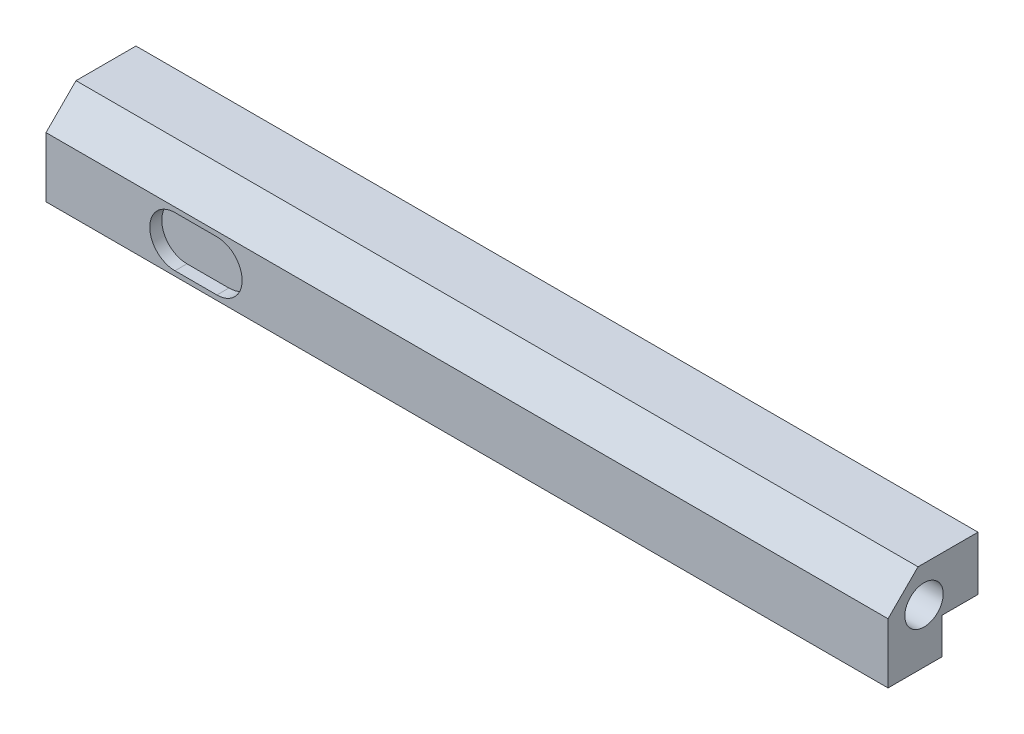
ISO-10303-21;
HEADER;
FILE_DESCRIPTION(('STEP AP214'),'2;1');
FILE_NAME('part.step','',(''),(''),'','','');
FILE_SCHEMA(('AUTOMOTIVE_DESIGN { 1 0 10303 214 1 1 1 1 }'));
ENDSEC;
DATA;
#1=APPLICATION_CONTEXT('core data for automotive mechanical design processes');
#2=APPLICATION_PROTOCOL_DEFINITION('international standard','automotive_design',2000,#1);
#3=PRODUCT_CONTEXT('',#1,'mechanical');
#4=PRODUCT('Part','Part','',(#3));
#5=PRODUCT_RELATED_PRODUCT_CATEGORY('part','',(#4));
#6=PRODUCT_DEFINITION_FORMATION('','',#4);
#7=PRODUCT_DEFINITION_CONTEXT('part definition',#1,'design');
#8=PRODUCT_DEFINITION('design','',#6,#7);
#9=PRODUCT_DEFINITION_SHAPE('','',#8);
#10=(LENGTH_UNIT() NAMED_UNIT(*) SI_UNIT(.MILLI.,.METRE.));
#11=(NAMED_UNIT(*) PLANE_ANGLE_UNIT() SI_UNIT($,.RADIAN.));
#12=(NAMED_UNIT(*) SI_UNIT($,.STERADIAN.) SOLID_ANGLE_UNIT());
#13=UNCERTAINTY_MEASURE_WITH_UNIT(LENGTH_MEASURE(1.E-05),#10,'distance_accuracy_value','');
#14=(GEOMETRIC_REPRESENTATION_CONTEXT(3) GLOBAL_UNCERTAINTY_ASSIGNED_CONTEXT((#13)) GLOBAL_UNIT_ASSIGNED_CONTEXT((#10,
#11,#12)) REPRESENTATION_CONTEXT('',''));
#15=CARTESIAN_POINT('',(0.,0.,0.));
#16=DIRECTION('',(0.,0.,1.));
#17=DIRECTION('',(1.,0.,0.));
#18=AXIS2_PLACEMENT_3D('',#15,#16,#17);
#19=CARTESIAN_POINT('',(70.2,-1.5,-1.5));
#20=DIRECTION('',(-1.,0.,0.));
#21=DIRECTION('',(0.,0.,1.));
#22=AXIS2_PLACEMENT_3D('',#19,#20,#21);
#23=CYLINDRICAL_SURFACE('',#22,2.35);
#24=CARTESIAN_POINT('',(-63.2,-1.5,-1.5));
#25=DIRECTION('',(-1.,0.,0.));
#26=DIRECTION('',(0.,0.,1.));
#27=AXIS2_PLACEMENT_3D('',#24,#25,#26);
#28=CIRCLE('',#27,2.35);
#29=CARTESIAN_POINT('',(-63.2,-1.5,0.85));
#30=VERTEX_POINT('',#29);
#31=EDGE_CURVE('E188',#30,#30,#28,.T.);
#32=ORIENTED_EDGE('',*,*,#31,.T.);
#33=EDGE_LOOP('',(#32));
#34=FACE_BOUND('',#33,.T.);
#35=CARTESIAN_POINT('',(63.2,-1.5,-1.5));
#36=DIRECTION('',(1.,0.,0.));
#37=DIRECTION('',(0.,0.,-1.));
#38=AXIS2_PLACEMENT_3D('',#35,#36,#37);
#39=CIRCLE('',#38,2.35);
#40=CARTESIAN_POINT('',(63.2,-1.5,-3.85));
#41=VERTEX_POINT('',#40);
#42=EDGE_CURVE('E174',#41,#41,#39,.T.);
#43=ORIENTED_EDGE('',*,*,#42,.T.);
#44=EDGE_LOOP('',(#43));
#45=FACE_BOUND('',#44,.T.);
#46=ADVANCED_FACE('F44',(#34,#45),#23,.F.);
#47=CARTESIAN_POINT('',(70.2,0.,0.));
#48=DIRECTION('',(-1.,0.,0.));
#49=DIRECTION('',(0.,0.,1.));
#50=AXIS2_PLACEMENT_3D('',#47,#48,#49);
#51=PLANE('',#50);
#52=CARTESIAN_POINT('',(70.2,-1.5,-1.5));
#53=DIRECTION('',(1.,0.,0.));
#54=DIRECTION('',(0.,0.,-1.));
#55=AXIS2_PLACEMENT_3D('',#52,#53,#54);
#56=CIRCLE('',#55,3.2);
#57=CARTESIAN_POINT('',(70.2,-1.5,-4.7));
#58=VERTEX_POINT('',#57);
#59=EDGE_CURVE('E183',#58,#58,#56,.T.);
#60=ORIENTED_EDGE('',*,*,#59,.F.);
#61=EDGE_LOOP('',(#60));
#62=FACE_BOUND('',#61,.T.);
#63=DIRECTION('',(0.,0.,1.));
#64=VECTOR('',#63,1.);
#65=CARTESIAN_POINT('',(70.2,4.5,4.5));
#66=LINE('',#65,#64);
#67=CARTESIAN_POINT('',(70.2,4.5,-10.5));
#68=VERTEX_POINT('',#67);
#69=CARTESIAN_POINT('',(70.2,4.5,-0.500000000000032));
#70=VERTEX_POINT('',#69);
#71=EDGE_CURVE('E218',#68,#70,#66,.T.);
#72=ORIENTED_EDGE('',*,*,#71,.T.);
#73=DIRECTION('',(0.,0.707106781186546,-0.707106781186549));
#74=VECTOR('',#73,1.);
#75=CARTESIAN_POINT('',(70.2,-0.500000000000004,4.5));
#76=LINE('',#75,#74);
#77=CARTESIAN_POINT('',(70.2,-0.500000000000004,4.5));
#78=VERTEX_POINT('',#77);
#79=EDGE_CURVE('E11',#70,#78,#76,.F.);
#80=ORIENTED_EDGE('',*,*,#79,.T.);
#81=DIRECTION('',(0.,-1.,0.));
#82=VECTOR('',#81,1.);
#83=CARTESIAN_POINT('',(70.2,-10.5,4.5));
#84=LINE('',#83,#82);
#85=CARTESIAN_POINT('',(70.2,-10.5,4.5));
#86=VERTEX_POINT('',#85);
#87=EDGE_CURVE('E221',#78,#86,#84,.T.);
#88=ORIENTED_EDGE('',*,*,#87,.T.);
#89=DIRECTION('',(0.,0.,-1.));
#90=VECTOR('',#89,1.);
#91=CARTESIAN_POINT('',(70.2,-10.5,-4.5));
#92=LINE('',#91,#90);
#93=CARTESIAN_POINT('',(70.2,-10.5,-4.5));
#94=VERTEX_POINT('',#93);
#95=EDGE_CURVE('E204',#86,#94,#92,.T.);
#96=ORIENTED_EDGE('',*,*,#95,.T.);
#97=DIRECTION('',(0.,1.,0.));
#98=VECTOR('',#97,1.);
#99=CARTESIAN_POINT('',(70.2,-4.5,-4.5));
#100=LINE('',#99,#98);
#101=CARTESIAN_POINT('',(70.2,-4.5,-4.5));
#102=VERTEX_POINT('',#101);
#103=EDGE_CURVE('E208',#94,#102,#100,.T.);
#104=ORIENTED_EDGE('',*,*,#103,.T.);
#105=DIRECTION('',(0.,0.,-1.));
#106=VECTOR('',#105,1.);
#107=CARTESIAN_POINT('',(70.2,-4.5,-10.5));
#108=LINE('',#107,#106);
#109=CARTESIAN_POINT('',(70.2,-4.5,-10.5));
#110=VERTEX_POINT('',#109);
#111=EDGE_CURVE('E212',#102,#110,#108,.T.);
#112=ORIENTED_EDGE('',*,*,#111,.T.);
#113=DIRECTION('',(0.,1.,0.));
#114=VECTOR('',#113,1.);
#115=CARTESIAN_POINT('',(70.2,4.5,-10.5));
#116=LINE('',#115,#114);
#117=EDGE_CURVE('E215',#110,#68,#116,.T.);
#118=ORIENTED_EDGE('',*,*,#117,.T.);
#119=EDGE_LOOP('',(#72,#80,#88,#96,#104,#112,#118));
#120=FACE_BOUND('',#119,.T.);
#121=ADVANCED_FACE('F281',(#62,#120),#51,.F.);
#122=CARTESIAN_POINT('',(-70.2,0.,0.));
#123=DIRECTION('',(-1.,0.,0.));
#124=DIRECTION('',(0.,0.,1.));
#125=AXIS2_PLACEMENT_3D('',#122,#123,#124);
#126=PLANE('',#125);
#127=CARTESIAN_POINT('',(-70.2,-1.5,-1.5));
#128=DIRECTION('',(-1.,0.,0.));
#129=DIRECTION('',(0.,0.,1.));
#130=AXIS2_PLACEMENT_3D('',#127,#128,#129);
#131=CIRCLE('',#130,3.2);
#132=CARTESIAN_POINT('',(-70.2,-1.5,1.7));
#133=VERTEX_POINT('',#132);
#134=EDGE_CURVE('E195',#133,#133,#131,.T.);
#135=ORIENTED_EDGE('',*,*,#134,.F.);
#136=EDGE_LOOP('',(#135));
#137=FACE_BOUND('',#136,.T.);
#138=DIRECTION('',(0.,-1.,0.));
#139=VECTOR('',#138,1.);
#140=CARTESIAN_POINT('',(-70.2,-10.5,4.5));
#141=LINE('',#140,#139);
#142=CARTESIAN_POINT('',(-70.2,-0.500000000000004,4.5));
#143=VERTEX_POINT('',#142);
#144=CARTESIAN_POINT('',(-70.2,-10.5,4.5));
#145=VERTEX_POINT('',#144);
#146=EDGE_CURVE('E209',#143,#145,#141,.T.);
#147=ORIENTED_EDGE('',*,*,#146,.F.);
#148=DIRECTION('',(0.,-0.707106781186546,0.707106781186549));
#149=VECTOR('',#148,1.);
#150=CARTESIAN_POINT('',(-70.2,2.,1.99999999999999));
#151=LINE('',#150,#149);
#152=CARTESIAN_POINT('',(-70.2,4.5,-0.500000000000032));
#153=VERTEX_POINT('',#152);
#154=EDGE_CURVE('E265',#143,#153,#151,.F.);
#155=ORIENTED_EDGE('',*,*,#154,.T.);
#156=DIRECTION('',(0.,0.,1.));
#157=VECTOR('',#156,1.);
#158=CARTESIAN_POINT('',(-70.2,4.5,4.5));
#159=LINE('',#158,#157);
#160=CARTESIAN_POINT('',(-70.2,4.5,-10.5));
#161=VERTEX_POINT('',#160);
#162=EDGE_CURVE('E237',#161,#153,#159,.T.);
#163=ORIENTED_EDGE('',*,*,#162,.F.);
#164=DIRECTION('',(0.,1.,0.));
#165=VECTOR('',#164,1.);
#166=CARTESIAN_POINT('',(-70.2,4.5,-10.5));
#167=LINE('',#166,#165);
#168=CARTESIAN_POINT('',(-70.2,-4.5,-10.5));
#169=VERTEX_POINT('',#168);
#170=EDGE_CURVE('E234',#169,#161,#167,.T.);
#171=ORIENTED_EDGE('',*,*,#170,.F.);
#172=DIRECTION('',(0.,0.,-1.));
#173=VECTOR('',#172,1.);
#174=CARTESIAN_POINT('',(-70.2,-4.5,-10.5));
#175=LINE('',#174,#173);
#176=CARTESIAN_POINT('',(-70.2,-4.5,-4.5));
#177=VERTEX_POINT('',#176);
#178=EDGE_CURVE('E231',#177,#169,#175,.T.);
#179=ORIENTED_EDGE('',*,*,#178,.F.);
#180=DIRECTION('',(0.,1.,0.));
#181=VECTOR('',#180,1.);
#182=CARTESIAN_POINT('',(-70.2,-4.5,-4.5));
#183=LINE('',#182,#181);
#184=CARTESIAN_POINT('',(-70.2,-10.5,-4.5));
#185=VERTEX_POINT('',#184);
#186=EDGE_CURVE('E228',#185,#177,#183,.T.);
#187=ORIENTED_EDGE('',*,*,#186,.F.);
#188=DIRECTION('',(0.,0.,-1.));
#189=VECTOR('',#188,1.);
#190=CARTESIAN_POINT('',(-70.2,-10.5,-4.5));
#191=LINE('',#190,#189);
#192=EDGE_CURVE('E200',#145,#185,#191,.T.);
#193=ORIENTED_EDGE('',*,*,#192,.F.);
#194=EDGE_LOOP('',(#147,#155,#163,#171,#179,#187,#193));
#195=FACE_BOUND('',#194,.T.);
#196=ADVANCED_FACE('F271',(#137,#195),#126,.T.);
#197=CARTESIAN_POINT('',(70.2,-10.5,-4.5));
#198=DIRECTION('',(0.,1.,0.));
#199=DIRECTION('',(0.,0.,1.));
#200=AXIS2_PLACEMENT_3D('',#197,#198,#199);
#201=PLANE('',#200);
#202=ORIENTED_EDGE('',*,*,#192,.T.);
#203=DIRECTION('',(-1.,0.,0.));
#204=VECTOR('',#203,1.);
#205=CARTESIAN_POINT('',(70.2,-10.5,-4.5));
#206=LINE('',#205,#204);
#207=EDGE_CURVE('E257',#94,#185,#206,.T.);
#208=ORIENTED_EDGE('',*,*,#207,.F.);
#209=ORIENTED_EDGE('',*,*,#95,.F.);
#210=DIRECTION('',(-1.,0.,0.));
#211=VECTOR('',#210,1.);
#212=CARTESIAN_POINT('',(70.2,-10.5,4.5));
#213=LINE('',#212,#211);
#214=EDGE_CURVE('E224',#86,#145,#213,.T.);
#215=ORIENTED_EDGE('',*,*,#214,.T.);
#216=EDGE_LOOP('',(#202,#208,#209,#215));
#217=FACE_BOUND('',#216,.T.);
#218=ADVANCED_FACE('F288',(#217),#201,.F.);
#219=CARTESIAN_POINT('',(70.2,-4.5,-4.5));
#220=DIRECTION('',(0.,0.,1.));
#221=DIRECTION('',(1.,0.,0.));
#222=AXIS2_PLACEMENT_3D('',#219,#220,#221);
#223=PLANE('',#222);
#224=ORIENTED_EDGE('',*,*,#186,.T.);
#225=DIRECTION('',(-1.,0.,0.));
#226=VECTOR('',#225,1.);
#227=CARTESIAN_POINT('',(70.2,-4.5,-4.5));
#228=LINE('',#227,#226);
#229=EDGE_CURVE('E253',#102,#177,#228,.T.);
#230=ORIENTED_EDGE('',*,*,#229,.F.);
#231=ORIENTED_EDGE('',*,*,#103,.F.);
#232=ORIENTED_EDGE('',*,*,#207,.T.);
#233=EDGE_LOOP('',(#224,#230,#231,#232));
#234=FACE_BOUND('',#233,.T.);
#235=ADVANCED_FACE('F293',(#234),#223,.F.);
#236=CARTESIAN_POINT('',(70.2,-4.5,-10.5));
#237=DIRECTION('',(0.,1.,0.));
#238=DIRECTION('',(0.,0.,1.));
#239=AXIS2_PLACEMENT_3D('',#236,#237,#238);
#240=PLANE('',#239);
#241=ORIENTED_EDGE('',*,*,#178,.T.);
#242=DIRECTION('',(-1.,0.,0.));
#243=VECTOR('',#242,1.);
#244=CARTESIAN_POINT('',(70.2,-4.5,-10.5));
#245=LINE('',#244,#243);
#246=EDGE_CURVE('E249',#110,#169,#245,.T.);
#247=ORIENTED_EDGE('',*,*,#246,.F.);
#248=ORIENTED_EDGE('',*,*,#111,.F.);
#249=ORIENTED_EDGE('',*,*,#229,.T.);
#250=EDGE_LOOP('',(#241,#247,#248,#249));
#251=FACE_BOUND('',#250,.T.);
#252=ADVANCED_FACE('F296',(#251),#240,.F.);
#253=CARTESIAN_POINT('',(70.2,4.5,-10.5));
#254=DIRECTION('',(0.,0.,1.));
#255=DIRECTION('',(0.,-1.,0.));
#256=AXIS2_PLACEMENT_3D('',#253,#254,#255);
#257=PLANE('',#256);
#258=ORIENTED_EDGE('',*,*,#170,.T.);
#259=DIRECTION('',(-1.,0.,0.));
#260=VECTOR('',#259,1.);
#261=CARTESIAN_POINT('',(70.2,4.5,-10.5));
#262=LINE('',#261,#260);
#263=EDGE_CURVE('E245',#68,#161,#262,.T.);
#264=ORIENTED_EDGE('',*,*,#263,.F.);
#265=ORIENTED_EDGE('',*,*,#117,.F.);
#266=ORIENTED_EDGE('',*,*,#246,.T.);
#267=EDGE_LOOP('',(#258,#264,#265,#266));
#268=FACE_BOUND('',#267,.T.);
#269=ADVANCED_FACE('F299',(#268),#257,.F.);
#270=CARTESIAN_POINT('',(70.2,4.5,4.5));
#271=DIRECTION('',(0.,-1.,0.));
#272=DIRECTION('',(0.,0.,-1.));
#273=AXIS2_PLACEMENT_3D('',#270,#271,#272);
#274=PLANE('',#273);
#275=ORIENTED_EDGE('',*,*,#162,.T.);
#276=DIRECTION('',(1.,0.,0.));
#277=VECTOR('',#276,1.);
#278=CARTESIAN_POINT('',(70.2,4.5,-0.500000000000032));
#279=LINE('',#278,#277);
#280=EDGE_CURVE('E54',#153,#70,#279,.T.);
#281=ORIENTED_EDGE('',*,*,#280,.T.);
#282=ORIENTED_EDGE('',*,*,#71,.F.);
#283=ORIENTED_EDGE('',*,*,#263,.T.);
#284=EDGE_LOOP('',(#275,#281,#282,#283));
#285=FACE_BOUND('',#284,.T.);
#286=ADVANCED_FACE('F276',(#285),#274,.F.);
#287=CARTESIAN_POINT('',(70.2,-10.5,4.5));
#288=DIRECTION('',(0.,0.,-1.));
#289=DIRECTION('',(0.,1.,0.));
#290=AXIS2_PLACEMENT_3D('',#287,#288,#289);
#291=PLANE('',#290);
#292=DIRECTION('',(1.,0.,0.));
#293=VECTOR('',#292,1.);
#294=CARTESIAN_POINT('',(-48.7,-9.7,4.5));
#295=LINE('',#294,#293);
#296=CARTESIAN_POINT('',(-48.7,-9.7,4.5));
#297=VERTEX_POINT('',#296);
#298=CARTESIAN_POINT('',(-41.7,-9.7,4.5));
#299=VERTEX_POINT('',#298);
#300=EDGE_CURVE('E165',#297,#299,#295,.T.);
#301=ORIENTED_EDGE('',*,*,#300,.F.);
#302=CARTESIAN_POINT('',(-48.7,-5.5,4.5));
#303=DIRECTION('',(0.,0.,1.));
#304=DIRECTION('',(1.,0.,0.));
#305=AXIS2_PLACEMENT_3D('',#302,#303,#304);
#306=CIRCLE('',#305,4.2);
#307=CARTESIAN_POINT('',(-48.7,-1.3,4.5));
#308=VERTEX_POINT('',#307);
#309=EDGE_CURVE('E61',#308,#297,#306,.T.);
#310=ORIENTED_EDGE('',*,*,#309,.F.);
#311=DIRECTION('',(-1.,0.,0.));
#312=VECTOR('',#311,1.);
#313=CARTESIAN_POINT('',(-48.7,-1.3,4.5));
#314=LINE('',#313,#312);
#315=CARTESIAN_POINT('',(-41.7,-1.3,4.5));
#316=VERTEX_POINT('',#315);
#317=EDGE_CURVE('E152',#316,#308,#314,.T.);
#318=ORIENTED_EDGE('',*,*,#317,.F.);
#319=CARTESIAN_POINT('',(-41.7,-5.5,4.5));
#320=DIRECTION('',(0.,0.,1.));
#321=DIRECTION('',(1.,0.,0.));
#322=AXIS2_PLACEMENT_3D('',#319,#320,#321);
#323=CIRCLE('',#322,4.2);
#324=EDGE_CURVE('E156',#299,#316,#323,.T.);
#325=ORIENTED_EDGE('',*,*,#324,.F.);
#326=EDGE_LOOP('',(#301,#310,#318,#325));
#327=FACE_BOUND('',#326,.T.);
#328=ORIENTED_EDGE('',*,*,#87,.F.);
#329=DIRECTION('',(-1.,0.,0.));
#330=VECTOR('',#329,1.);
#331=CARTESIAN_POINT('',(70.2,-0.500000000000004,4.5));
#332=LINE('',#331,#330);
#333=EDGE_CURVE('E261',#78,#143,#332,.T.);
#334=ORIENTED_EDGE('',*,*,#333,.T.);
#335=ORIENTED_EDGE('',*,*,#146,.T.);
#336=ORIENTED_EDGE('',*,*,#214,.F.);
#337=EDGE_LOOP('',(#328,#334,#335,#336));
#338=FACE_BOUND('',#337,.T.);
#339=ADVANCED_FACE('F284',(#327,#338),#291,.F.);
#340=CARTESIAN_POINT('',(70.2,-0.500000000000004,4.5));
#341=DIRECTION('',(0.,-0.707106781186549,-0.707106781186545));
#342=DIRECTION('',(-1.,0.,0.));
#343=AXIS2_PLACEMENT_3D('',#340,#341,#342);
#344=PLANE('',#343);
#345=ORIENTED_EDGE('',*,*,#79,.F.);
#346=ORIENTED_EDGE('',*,*,#280,.F.);
#347=ORIENTED_EDGE('',*,*,#154,.F.);
#348=ORIENTED_EDGE('',*,*,#333,.F.);
#349=EDGE_LOOP('',(#345,#346,#347,#348));
#350=FACE_BOUND('',#349,.T.);
#351=ADVANCED_FACE('F47',(#350),#344,.F.);
#352=CARTESIAN_POINT('',(-63.2,-1.5,-1.5));
#353=DIRECTION('',(-1.,0.,0.));
#354=DIRECTION('',(0.,0.,1.));
#355=AXIS2_PLACEMENT_3D('',#352,#353,#354);
#356=CYLINDRICAL_SURFACE('',#355,3.2);
#357=CARTESIAN_POINT('',(-63.2,-1.5,-1.5));
#358=DIRECTION('',(-1.,0.,0.));
#359=DIRECTION('',(0.,0.,1.));
#360=AXIS2_PLACEMENT_3D('',#357,#358,#359);
#361=CIRCLE('',#360,3.2);
#362=CARTESIAN_POINT('',(-63.2,-1.5,1.7));
#363=VERTEX_POINT('',#362);
#364=EDGE_CURVE('E196',#363,#363,#361,.T.);
#365=ORIENTED_EDGE('',*,*,#364,.F.);
#366=EDGE_LOOP('',(#365));
#367=FACE_BOUND('',#366,.T.);
#368=ORIENTED_EDGE('',*,*,#134,.T.);
#369=EDGE_LOOP('',(#368));
#370=FACE_BOUND('',#369,.T.);
#371=ADVANCED_FACE('F318',(#367,#370),#356,.F.);
#372=CARTESIAN_POINT('',(-63.2,-1.5,-1.5));
#373=DIRECTION('',(-1.,0.,0.));
#374=DIRECTION('',(0.,0.,1.));
#375=AXIS2_PLACEMENT_3D('',#372,#373,#374);
#376=PLANE('',#375);
#377=ORIENTED_EDGE('',*,*,#31,.F.);
#378=EDGE_LOOP('',(#377));
#379=FACE_BOUND('',#378,.T.);
#380=ORIENTED_EDGE('',*,*,#364,.T.);
#381=EDGE_LOOP('',(#380));
#382=FACE_BOUND('',#381,.T.);
#383=ADVANCED_FACE('F353',(#379,#382),#376,.T.);
#384=CARTESIAN_POINT('',(63.2,-1.5,-1.5));
#385=DIRECTION('',(1.,0.,0.));
#386=DIRECTION('',(0.,0.,-1.));
#387=AXIS2_PLACEMENT_3D('',#384,#385,#386);
#388=CYLINDRICAL_SURFACE('',#387,3.2);
#389=CARTESIAN_POINT('',(63.2,-1.5,-1.5));
#390=DIRECTION('',(1.,0.,0.));
#391=DIRECTION('',(0.,0.,-1.));
#392=AXIS2_PLACEMENT_3D('',#389,#390,#391);
#393=CIRCLE('',#392,3.2);
#394=CARTESIAN_POINT('',(63.2,-1.5,-4.7));
#395=VERTEX_POINT('',#394);
#396=EDGE_CURVE('E184',#395,#395,#393,.T.);
#397=ORIENTED_EDGE('',*,*,#396,.F.);
#398=EDGE_LOOP('',(#397));
#399=FACE_BOUND('',#398,.T.);
#400=ORIENTED_EDGE('',*,*,#59,.T.);
#401=EDGE_LOOP('',(#400));
#402=FACE_BOUND('',#401,.T.);
#403=ADVANCED_FACE('F350',(#399,#402),#388,.F.);
#404=CARTESIAN_POINT('',(63.2,-1.5,-1.5));
#405=DIRECTION('',(1.,0.,0.));
#406=DIRECTION('',(0.,0.,-1.));
#407=AXIS2_PLACEMENT_3D('',#404,#405,#406);
#408=PLANE('',#407);
#409=ORIENTED_EDGE('',*,*,#42,.F.);
#410=EDGE_LOOP('',(#409));
#411=FACE_BOUND('',#410,.T.);
#412=ORIENTED_EDGE('',*,*,#396,.T.);
#413=EDGE_LOOP('',(#412));
#414=FACE_BOUND('',#413,.T.);
#415=ADVANCED_FACE('F342',(#411,#414),#408,.T.);
#416=CARTESIAN_POINT('',(-48.7,-5.5,2.5));
#417=DIRECTION('',(0.,0.,1.));
#418=DIRECTION('',(1.,0.,0.));
#419=AXIS2_PLACEMENT_3D('',#416,#417,#418);
#420=CYLINDRICAL_SURFACE('',#419,4.2);
#421=ORIENTED_EDGE('',*,*,#309,.T.);
#422=DIRECTION('',(0.,0.,1.));
#423=VECTOR('',#422,1.);
#424=CARTESIAN_POINT('',(-48.7,-9.7,2.5));
#425=LINE('',#424,#423);
#426=CARTESIAN_POINT('',(-48.7,-9.7,2.5));
#427=VERTEX_POINT('',#426);
#428=EDGE_CURVE('E127',#427,#297,#425,.T.);
#429=ORIENTED_EDGE('',*,*,#428,.F.);
#430=CARTESIAN_POINT('',(-48.7,-5.5,2.5));
#431=DIRECTION('',(0.,0.,1.));
#432=DIRECTION('',(1.,0.,0.));
#433=AXIS2_PLACEMENT_3D('',#430,#431,#432);
#434=CIRCLE('',#433,4.2);
#435=CARTESIAN_POINT('',(-48.7,-1.3,2.5));
#436=VERTEX_POINT('',#435);
#437=EDGE_CURVE('E131',#436,#427,#434,.T.);
#438=ORIENTED_EDGE('',*,*,#437,.F.);
#439=DIRECTION('',(0.,0.,1.));
#440=VECTOR('',#439,1.);
#441=CARTESIAN_POINT('',(-48.7,-1.3,2.5));
#442=LINE('',#441,#440);
#443=EDGE_CURVE('E171',#436,#308,#442,.T.);
#444=ORIENTED_EDGE('',*,*,#443,.T.);
#445=EDGE_LOOP('',(#421,#429,#438,#444));
#446=FACE_BOUND('',#445,.T.);
#447=ADVANCED_FACE('F129',(#446),#420,.F.);
#448=CARTESIAN_POINT('',(-48.7,-1.3,2.5));
#449=DIRECTION('',(0.,1.,0.));
#450=DIRECTION('',(-1.,0.,0.));
#451=AXIS2_PLACEMENT_3D('',#448,#449,#450);
#452=PLANE('',#451);
#453=ORIENTED_EDGE('',*,*,#317,.T.);
#454=ORIENTED_EDGE('',*,*,#443,.F.);
#455=DIRECTION('',(-1.,0.,0.));
#456=VECTOR('',#455,1.);
#457=CARTESIAN_POINT('',(-48.7,-1.3,2.5));
#458=LINE('',#457,#456);
#459=CARTESIAN_POINT('',(-41.7,-1.3,2.5));
#460=VERTEX_POINT('',#459);
#461=EDGE_CURVE('E138',#460,#436,#458,.T.);
#462=ORIENTED_EDGE('',*,*,#461,.F.);
#463=DIRECTION('',(0.,0.,1.));
#464=VECTOR('',#463,1.);
#465=CARTESIAN_POINT('',(-41.7,-1.3,2.5));
#466=LINE('',#465,#464);
#467=EDGE_CURVE('E175',#460,#316,#466,.T.);
#468=ORIENTED_EDGE('',*,*,#467,.T.);
#469=EDGE_LOOP('',(#453,#454,#462,#468));
#470=FACE_BOUND('',#469,.T.);
#471=ADVANCED_FACE('F334',(#470),#452,.F.);
#472=CARTESIAN_POINT('',(-41.7,-5.5,2.5));
#473=DIRECTION('',(0.,0.,1.));
#474=DIRECTION('',(1.,0.,0.));
#475=AXIS2_PLACEMENT_3D('',#472,#473,#474);
#476=CYLINDRICAL_SURFACE('',#475,4.2);
#477=ORIENTED_EDGE('',*,*,#324,.T.);
#478=ORIENTED_EDGE('',*,*,#467,.F.);
#479=CARTESIAN_POINT('',(-41.7,-5.5,2.5));
#480=DIRECTION('',(0.,0.,1.));
#481=DIRECTION('',(1.,0.,0.));
#482=AXIS2_PLACEMENT_3D('',#479,#480,#481);
#483=CIRCLE('',#482,4.2);
#484=CARTESIAN_POINT('',(-41.7,-9.7,2.5));
#485=VERTEX_POINT('',#484);
#486=EDGE_CURVE('E147',#485,#460,#483,.T.);
#487=ORIENTED_EDGE('',*,*,#486,.F.);
#488=DIRECTION('',(0.,0.,1.));
#489=VECTOR('',#488,1.);
#490=CARTESIAN_POINT('',(-41.7,-9.7,2.5));
#491=LINE('',#490,#489);
#492=EDGE_CURVE('E137',#485,#299,#491,.T.);
#493=ORIENTED_EDGE('',*,*,#492,.T.);
#494=EDGE_LOOP('',(#477,#478,#487,#493));
#495=FACE_BOUND('',#494,.T.);
#496=ADVANCED_FACE('F332',(#495),#476,.F.);
#497=CARTESIAN_POINT('',(-48.7,-9.7,2.5));
#498=DIRECTION('',(0.,-1.,0.));
#499=DIRECTION('',(1.,0.,0.));
#500=AXIS2_PLACEMENT_3D('',#497,#498,#499);
#501=PLANE('',#500);
#502=ORIENTED_EDGE('',*,*,#300,.T.);
#503=ORIENTED_EDGE('',*,*,#492,.F.);
#504=DIRECTION('',(1.,0.,0.));
#505=VECTOR('',#504,1.);
#506=CARTESIAN_POINT('',(-48.7,-9.7,2.5));
#507=LINE('',#506,#505);
#508=EDGE_CURVE('E141',#427,#485,#507,.T.);
#509=ORIENTED_EDGE('',*,*,#508,.F.);
#510=ORIENTED_EDGE('',*,*,#428,.T.);
#511=EDGE_LOOP('',(#502,#503,#509,#510));
#512=FACE_BOUND('',#511,.T.);
#513=ADVANCED_FACE('F142',(#512),#501,.F.);
#514=CARTESIAN_POINT('',(-48.7,-5.5,2.5));
#515=DIRECTION('',(0.,0.,1.));
#516=DIRECTION('',(1.,0.,0.));
#517=AXIS2_PLACEMENT_3D('',#514,#515,#516);
#518=PLANE('',#517);
#519=ORIENTED_EDGE('',*,*,#437,.T.);
#520=ORIENTED_EDGE('',*,*,#508,.T.);
#521=ORIENTED_EDGE('',*,*,#486,.T.);
#522=ORIENTED_EDGE('',*,*,#461,.T.);
#523=EDGE_LOOP('',(#519,#520,#521,#522));
#524=FACE_BOUND('',#523,.T.);
#525=ADVANCED_FACE('F149',(#524),#518,.T.);
#526=CLOSED_SHELL('',(#46,#121,#196,#218,#235,#252,#269,#286,#339,#351,#371,#383,#403,#415,#447,
#471,#496,#513,#525));
#527=MANIFOLD_SOLID_BREP('B2',#526);
#528=ADVANCED_BREP_SHAPE_REPRESENTATION('',(#18,#527),#14);
#529=SHAPE_DEFINITION_REPRESENTATION(#9,#528);
ENDSEC;
END-ISO-10303-21;
